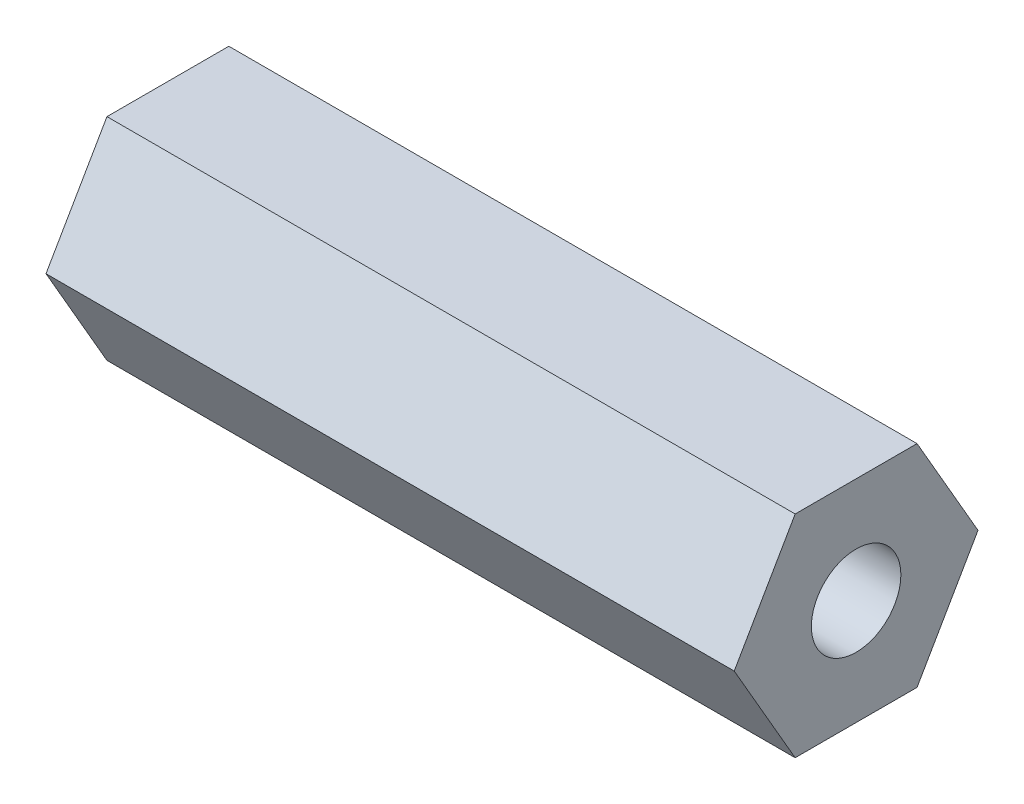
ISO-10303-21;
HEADER;
FILE_DESCRIPTION(('STEP AP214'),'2;1');
FILE_NAME('part.step','',(''),(''),'','','');
FILE_SCHEMA(('AUTOMOTIVE_DESIGN { 1 0 10303 214 1 1 1 1 }'));
ENDSEC;
DATA;
#1=APPLICATION_CONTEXT('core data for automotive mechanical design processes');
#2=APPLICATION_PROTOCOL_DEFINITION('international standard','automotive_design',2000,#1);
#3=PRODUCT_CONTEXT('',#1,'mechanical');
#4=PRODUCT('Part','Part','',(#3));
#5=PRODUCT_RELATED_PRODUCT_CATEGORY('part','',(#4));
#6=PRODUCT_DEFINITION_FORMATION('','',#4);
#7=PRODUCT_DEFINITION_CONTEXT('part definition',#1,'design');
#8=PRODUCT_DEFINITION('design','',#6,#7);
#9=PRODUCT_DEFINITION_SHAPE('','',#8);
#10=(LENGTH_UNIT() NAMED_UNIT(*) SI_UNIT(.MILLI.,.METRE.));
#11=(NAMED_UNIT(*) PLANE_ANGLE_UNIT() SI_UNIT($,.RADIAN.));
#12=(NAMED_UNIT(*) SI_UNIT($,.STERADIAN.) SOLID_ANGLE_UNIT());
#13=UNCERTAINTY_MEASURE_WITH_UNIT(LENGTH_MEASURE(1.E-05),#10,'distance_accuracy_value','');
#14=(GEOMETRIC_REPRESENTATION_CONTEXT(3) GLOBAL_UNCERTAINTY_ASSIGNED_CONTEXT((#13)) GLOBAL_UNIT_ASSIGNED_CONTEXT((#10,
#11,#12)) REPRESENTATION_CONTEXT('',''));
#15=CARTESIAN_POINT('',(0.,0.,0.));
#16=DIRECTION('',(0.,0.,1.));
#17=DIRECTION('',(1.,0.,0.));
#18=AXIS2_PLACEMENT_3D('',#15,#16,#17);
#19=CARTESIAN_POINT('',(38.1,0.,0.));
#20=DIRECTION('',(1.,0.,0.));
#21=DIRECTION('',(0.,1.,0.));
#22=AXIS2_PLACEMENT_3D('',#19,#20,#21);
#23=PLANE('',#22);
#24=CARTESIAN_POINT('',(38.1,0.,0.));
#25=DIRECTION('',(1.,0.,0.));
#26=DIRECTION('',(0.,0.,-1.));
#27=AXIS2_PLACEMENT_3D('',#24,#25,#26);
#28=CIRCLE('',#27,2.0193);
#29=CARTESIAN_POINT('',(38.1,0.,-2.0193));
#30=VERTEX_POINT('',#29);
#31=EDGE_CURVE('E126',#30,#30,#28,.T.);
#32=ORIENTED_EDGE('',*,*,#31,.F.);
#33=EDGE_LOOP('',(#32));
#34=FACE_BOUND('',#33,.T.);
#35=DIRECTION('',(0.,0.866025403784442,-0.5));
#36=VECTOR('',#35,1.);
#37=CARTESIAN_POINT('',(38.1,-4.7625,-2.74963065701564));
#38=LINE('',#37,#36);
#39=CARTESIAN_POINT('',(38.1,-4.7625,-2.74963065701564));
#40=VERTEX_POINT('',#39);
#41=CARTESIAN_POINT('',(38.1,0.,-5.49926131403117));
#42=VERTEX_POINT('',#41);
#43=EDGE_CURVE('E151',#40,#42,#38,.T.);
#44=ORIENTED_EDGE('',*,*,#43,.T.);
#45=DIRECTION('',(0.,0.866025403784438,0.5));
#46=VECTOR('',#45,1.);
#47=CARTESIAN_POINT('',(38.1,0.,-5.49926131403117));
#48=LINE('',#47,#46);
#49=CARTESIAN_POINT('',(38.1,4.7625,-2.74963065701557));
#50=VERTEX_POINT('',#49);
#51=EDGE_CURVE('E100',#42,#50,#48,.T.);
#52=ORIENTED_EDGE('',*,*,#51,.T.);
#53=DIRECTION('',(0.,0.,1.));
#54=VECTOR('',#53,1.);
#55=CARTESIAN_POINT('',(38.1,4.7625,-2.74963065701557));
#56=LINE('',#55,#54);
#57=CARTESIAN_POINT('',(38.1,4.7625,2.7496306570156));
#58=VERTEX_POINT('',#57);
#59=EDGE_CURVE('E139',#50,#58,#56,.T.);
#60=ORIENTED_EDGE('',*,*,#59,.T.);
#61=DIRECTION('',(0.,-0.866025403784442,0.5));
#62=VECTOR('',#61,1.);
#63=CARTESIAN_POINT('',(38.1,4.7625,2.7496306570156));
#64=LINE('',#63,#62);
#65=CARTESIAN_POINT('',(38.1,0.,5.49926131403117));
#66=VERTEX_POINT('',#65);
#67=EDGE_CURVE('E138',#58,#66,#64,.T.);
#68=ORIENTED_EDGE('',*,*,#67,.T.);
#69=DIRECTION('',(0.,-0.866025403784435,-0.500000000000007));
#70=VECTOR('',#69,1.);
#71=CARTESIAN_POINT('',(38.1,0.,5.49926131403117));
#72=LINE('',#71,#70);
#73=CARTESIAN_POINT('',(38.1,-4.7625,2.74963065701554));
#74=VERTEX_POINT('',#73);
#75=EDGE_CURVE('E53',#66,#74,#72,.T.);
#76=ORIENTED_EDGE('',*,*,#75,.T.);
#77=DIRECTION('',(0.,0.,-1.));
#78=VECTOR('',#77,1.);
#79=CARTESIAN_POINT('',(38.1,-4.7625,2.74963065701554));
#80=LINE('',#79,#78);
#81=EDGE_CURVE('E11',#74,#40,#80,.T.);
#82=ORIENTED_EDGE('',*,*,#81,.T.);
#83=EDGE_LOOP('',(#44,#52,#60,#68,#76,#82));
#84=FACE_BOUND('',#83,.T.);
#85=ADVANCED_FACE('F43',(#34,#84),#23,.T.);
#86=CARTESIAN_POINT('',(38.1,-4.7625,2.74963065701554));
#87=DIRECTION('',(0.,1.,0.));
#88=DIRECTION('',(0.,0.,-1.));
#89=AXIS2_PLACEMENT_3D('',#86,#87,#88);
#90=PLANE('',#89);
#91=DIRECTION('',(-1.,0.,0.));
#92=VECTOR('',#91,1.);
#93=CARTESIAN_POINT('',(38.1,-4.7625,2.74963065701554));
#94=LINE('',#93,#92);
#95=CARTESIAN_POINT('',(7.0485,-4.76249999999999,2.74963065701555));
#96=VERTEX_POINT('',#95);
#97=EDGE_CURVE('E145',#74,#96,#94,.T.);
#98=ORIENTED_EDGE('',*,*,#97,.T.);
#99=DIRECTION('',(0.,0.,-1.));
#100=VECTOR('',#99,1.);
#101=CARTESIAN_POINT('',(7.0485,-4.7625,2.74963065701554));
#102=LINE('',#101,#100);
#103=CARTESIAN_POINT('',(7.0485,-4.7625,-2.74963065701564));
#104=VERTEX_POINT('',#103);
#105=EDGE_CURVE('E122',#96,#104,#102,.T.);
#106=ORIENTED_EDGE('',*,*,#105,.T.);
#107=DIRECTION('',(-1.,0.,0.));
#108=VECTOR('',#107,1.);
#109=CARTESIAN_POINT('',(38.1,-4.7625,-2.74963065701564));
#110=LINE('',#109,#108);
#111=EDGE_CURVE('E154',#40,#104,#110,.T.);
#112=ORIENTED_EDGE('',*,*,#111,.F.);
#113=ORIENTED_EDGE('',*,*,#81,.F.);
#114=EDGE_LOOP('',(#98,#106,#112,#113));
#115=FACE_BOUND('',#114,.T.);
#116=ADVANCED_FACE('F180',(#115),#90,.F.);
#117=CARTESIAN_POINT('',(38.1,0.,5.49926131403117));
#118=DIRECTION('',(0.,0.500000000000007,-0.866025403784435));
#119=DIRECTION('',(-1.,0.,0.));
#120=AXIS2_PLACEMENT_3D('',#117,#118,#119);
#121=PLANE('',#120);
#122=DIRECTION('',(-1.,0.,0.));
#123=VECTOR('',#122,1.);
#124=CARTESIAN_POINT('',(38.1,0.,5.49926131403117));
#125=LINE('',#124,#123);
#126=CARTESIAN_POINT('',(7.0485,0.,5.49926131403121));
#127=VERTEX_POINT('',#126);
#128=EDGE_CURVE('E132',#66,#127,#125,.T.);
#129=ORIENTED_EDGE('',*,*,#128,.T.);
#130=DIRECTION('',(0.,-0.866025403784435,-0.500000000000007));
#131=VECTOR('',#130,1.);
#132=CARTESIAN_POINT('',(7.0485,0.,5.49926131403117));
#133=LINE('',#132,#131);
#134=EDGE_CURVE('E116',#127,#96,#133,.T.);
#135=ORIENTED_EDGE('',*,*,#134,.T.);
#136=ORIENTED_EDGE('',*,*,#97,.F.);
#137=ORIENTED_EDGE('',*,*,#75,.F.);
#138=EDGE_LOOP('',(#129,#135,#136,#137));
#139=FACE_BOUND('',#138,.T.);
#140=ADVANCED_FACE('F45',(#139),#121,.F.);
#141=CARTESIAN_POINT('',(38.1,4.7625,2.7496306570156));
#142=DIRECTION('',(0.,-0.5,-0.866025403784442));
#143=DIRECTION('',(0.,-0.866025403784442,0.5));
#144=AXIS2_PLACEMENT_3D('',#141,#142,#143);
#145=PLANE('',#144);
#146=DIRECTION('',(-1.,0.,0.));
#147=VECTOR('',#146,1.);
#148=CARTESIAN_POINT('',(38.1,4.7625,2.7496306570156));
#149=LINE('',#148,#147);
#150=CARTESIAN_POINT('',(7.0485,4.76249999999998,2.74963065701562));
#151=VERTEX_POINT('',#150);
#152=EDGE_CURVE('E134',#58,#151,#149,.T.);
#153=ORIENTED_EDGE('',*,*,#152,.T.);
#154=DIRECTION('',(0.,0.866025403784439,-0.499999999999999));
#155=VECTOR('',#154,1.);
#156=CARTESIAN_POINT('',(7.0485,7.14374999999999,1.37481532850782));
#157=LINE('',#156,#155);
#158=EDGE_CURVE('E119',#127,#151,#157,.T.);
#159=ORIENTED_EDGE('',*,*,#158,.F.);
#160=ORIENTED_EDGE('',*,*,#128,.F.);
#161=ORIENTED_EDGE('',*,*,#67,.F.);
#162=EDGE_LOOP('',(#153,#159,#160,#161));
#163=FACE_BOUND('',#162,.T.);
#164=ADVANCED_FACE('F131',(#163),#145,.F.);
#165=CARTESIAN_POINT('',(38.1,4.7625,-2.74963065701557));
#166=DIRECTION('',(0.,-1.,0.));
#167=DIRECTION('',(0.,0.,-1.));
#168=AXIS2_PLACEMENT_3D('',#165,#166,#167);
#169=PLANE('',#168);
#170=DIRECTION('',(-1.,0.,0.));
#171=VECTOR('',#170,1.);
#172=CARTESIAN_POINT('',(38.1,4.7625,-2.74963065701557));
#173=LINE('',#172,#171);
#174=CARTESIAN_POINT('',(7.0485,4.76249999999999,-2.74963065701558));
#175=VERTEX_POINT('',#174);
#176=EDGE_CURVE('E174',#50,#175,#173,.T.);
#177=ORIENTED_EDGE('',*,*,#176,.T.);
#178=DIRECTION('',(0.,0.,1.));
#179=VECTOR('',#178,1.);
#180=CARTESIAN_POINT('',(7.0485,4.7625,-2.74963065701557));
#181=LINE('',#180,#179);
#182=EDGE_CURVE('E183',#175,#151,#181,.T.);
#183=ORIENTED_EDGE('',*,*,#182,.T.);
#184=ORIENTED_EDGE('',*,*,#152,.F.);
#185=ORIENTED_EDGE('',*,*,#59,.F.);
#186=EDGE_LOOP('',(#177,#183,#184,#185));
#187=FACE_BOUND('',#186,.T.);
#188=ADVANCED_FACE('F222',(#187),#169,.F.);
#189=CARTESIAN_POINT('',(38.1,0.,-5.49926131403117));
#190=DIRECTION('',(0.,-0.5,0.866025403784438));
#191=DIRECTION('',(-1.,0.,0.));
#192=AXIS2_PLACEMENT_3D('',#189,#190,#191);
#193=PLANE('',#192);
#194=DIRECTION('',(-1.,0.,0.));
#195=VECTOR('',#194,1.);
#196=CARTESIAN_POINT('',(38.1,0.,-5.49926131403117));
#197=LINE('',#196,#195);
#198=CARTESIAN_POINT('',(7.0485,0.,-5.49926131403117));
#199=VERTEX_POINT('',#198);
#200=EDGE_CURVE('E155',#42,#199,#197,.T.);
#201=ORIENTED_EDGE('',*,*,#200,.T.);
#202=DIRECTION('',(0.,0.866025403784438,0.5));
#203=VECTOR('',#202,1.);
#204=CARTESIAN_POINT('',(7.0485,0.,-5.49926131403117));
#205=LINE('',#204,#203);
#206=EDGE_CURVE('E61',#199,#175,#205,.T.);
#207=ORIENTED_EDGE('',*,*,#206,.T.);
#208=ORIENTED_EDGE('',*,*,#176,.F.);
#209=ORIENTED_EDGE('',*,*,#51,.F.);
#210=EDGE_LOOP('',(#201,#207,#208,#209));
#211=FACE_BOUND('',#210,.T.);
#212=ADVANCED_FACE('F226',(#211),#193,.F.);
#213=CARTESIAN_POINT('',(38.1,-4.7625,-2.74963065701564));
#214=DIRECTION('',(0.,0.5,0.866025403784442));
#215=DIRECTION('',(1.,0.,0.));
#216=AXIS2_PLACEMENT_3D('',#213,#214,#215);
#217=PLANE('',#216);
#218=ORIENTED_EDGE('',*,*,#111,.T.);
#219=DIRECTION('',(0.,0.866025403784439,-0.499999999999999));
#220=VECTOR('',#219,1.);
#221=CARTESIAN_POINT('',(7.0485,-4.7625,-2.74963065701564));
#222=LINE('',#221,#220);
#223=EDGE_CURVE('E187',#104,#199,#222,.T.);
#224=ORIENTED_EDGE('',*,*,#223,.T.);
#225=ORIENTED_EDGE('',*,*,#200,.F.);
#226=ORIENTED_EDGE('',*,*,#43,.F.);
#227=EDGE_LOOP('',(#218,#224,#225,#226));
#228=FACE_BOUND('',#227,.T.);
#229=ADVANCED_FACE('F186',(#228),#217,.F.);
#230=CARTESIAN_POINT('',(-38.1,0.,0.));
#231=DIRECTION('',(-1.,0.,0.));
#232=DIRECTION('',(0.,0.,1.));
#233=AXIS2_PLACEMENT_3D('',#230,#231,#232);
#234=CYLINDRICAL_SURFACE('',#233,2.0193);
#235=CARTESIAN_POINT('',(7.0485,0.,0.));
#236=DIRECTION('',(1.,0.,0.));
#237=DIRECTION('',(0.,0.,-1.));
#238=AXIS2_PLACEMENT_3D('',#235,#236,#237);
#239=CIRCLE('',#238,2.0193);
#240=CARTESIAN_POINT('',(7.0485,0.,-2.0193));
#241=VERTEX_POINT('',#240);
#242=EDGE_CURVE('E47',#241,#241,#239,.F.);
#243=ORIENTED_EDGE('',*,*,#242,.T.);
#244=EDGE_LOOP('',(#243));
#245=FACE_BOUND('',#244,.T.);
#246=ORIENTED_EDGE('',*,*,#31,.T.);
#247=EDGE_LOOP('',(#246));
#248=FACE_BOUND('',#247,.T.);
#249=ADVANCED_FACE('F205',(#245,#248),#234,.F.);
#250=CARTESIAN_POINT('',(7.0485,1.19062500000001,-8.93629963530066));
#251=DIRECTION('',(1.,0.,0.));
#252=DIRECTION('',(0.,0.,-1.));
#253=AXIS2_PLACEMENT_3D('',#250,#251,#252);
#254=PLANE('',#253);
#255=ORIENTED_EDGE('',*,*,#242,.F.);
#256=EDGE_LOOP('',(#255));
#257=FACE_BOUND('',#256,.T.);
#258=ORIENTED_EDGE('',*,*,#158,.T.);
#259=ORIENTED_EDGE('',*,*,#182,.F.);
#260=ORIENTED_EDGE('',*,*,#206,.F.);
#261=ORIENTED_EDGE('',*,*,#223,.F.);
#262=ORIENTED_EDGE('',*,*,#105,.F.);
#263=ORIENTED_EDGE('',*,*,#134,.F.);
#264=EDGE_LOOP('',(#258,#259,#260,#261,#262,#263));
#265=FACE_BOUND('',#264,.T.);
#266=ADVANCED_FACE('F118',(#257,#265),#254,.F.);
#267=CLOSED_SHELL('',(#85,#116,#140,#164,#188,#212,#229,#249,#266));
#268=MANIFOLD_SOLID_BREP('B2',#267);
#269=ADVANCED_BREP_SHAPE_REPRESENTATION('',(#18,#268),#14);
#270=SHAPE_DEFINITION_REPRESENTATION(#9,#269);
ENDSEC;
END-ISO-10303-21;
